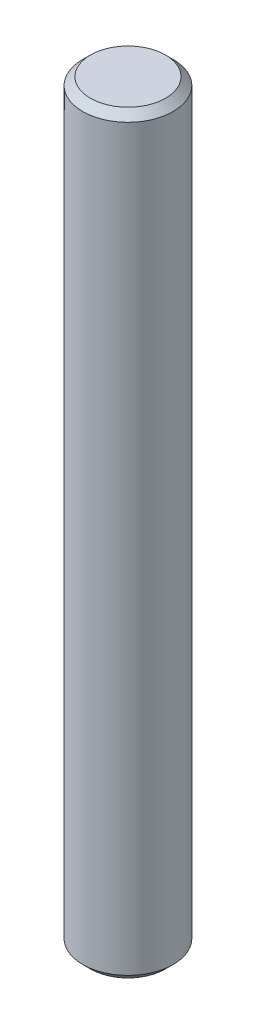
ISO-10303-21;
HEADER;
FILE_DESCRIPTION(('STEP AP214'),'2;1');
FILE_NAME('part.step','',(''),(''),'','','');
FILE_SCHEMA(('AUTOMOTIVE_DESIGN { 1 0 10303 214 1 1 1 1 }'));
ENDSEC;
DATA;
#1=APPLICATION_CONTEXT('core data for automotive mechanical design processes');
#2=APPLICATION_PROTOCOL_DEFINITION('international standard','automotive_design',2000,#1);
#3=PRODUCT_CONTEXT('',#1,'mechanical');
#4=PRODUCT('Part','Part','',(#3));
#5=PRODUCT_RELATED_PRODUCT_CATEGORY('part','',(#4));
#6=PRODUCT_DEFINITION_FORMATION('','',#4);
#7=PRODUCT_DEFINITION_CONTEXT('part definition',#1,'design');
#8=PRODUCT_DEFINITION('design','',#6,#7);
#9=PRODUCT_DEFINITION_SHAPE('','',#8);
#10=(LENGTH_UNIT() NAMED_UNIT(*) SI_UNIT(.MILLI.,.METRE.));
#11=(NAMED_UNIT(*) PLANE_ANGLE_UNIT() SI_UNIT($,.RADIAN.));
#12=(NAMED_UNIT(*) SI_UNIT($,.STERADIAN.) SOLID_ANGLE_UNIT());
#13=UNCERTAINTY_MEASURE_WITH_UNIT(LENGTH_MEASURE(1.E-05),#10,'distance_accuracy_value','');
#14=(GEOMETRIC_REPRESENTATION_CONTEXT(3) GLOBAL_UNCERTAINTY_ASSIGNED_CONTEXT((#13)) GLOBAL_UNIT_ASSIGNED_CONTEXT((#10,
#11,#12)) REPRESENTATION_CONTEXT('',''));
#15=CARTESIAN_POINT('',(0.,0.,0.));
#16=DIRECTION('',(0.,0.,1.));
#17=DIRECTION('',(1.,0.,0.));
#18=AXIS2_PLACEMENT_3D('',#15,#16,#17);
#19=CARTESIAN_POINT('',(0.,0.508000000000002,0.));
#20=DIRECTION('',(0.,1.,0.));
#21=DIRECTION('',(-1.,0.,0.));
#22=AXIS2_PLACEMENT_3D('',#19,#20,#21);
#23=CONICAL_SURFACE('',#22,2.99618999989459,0.785398163397448);
#24=CARTESIAN_POINT('',(0.,0.,0.));
#25=DIRECTION('',(0.,1.,0.));
#26=DIRECTION('',(-1.,0.,0.));
#27=AXIS2_PLACEMENT_3D('',#24,#25,#26);
#28=CIRCLE('',#27,2.48818999989459);
#29=CARTESIAN_POINT('',(-2.48818999989464,0.,0.));
#30=VERTEX_POINT('',#29);
#31=EDGE_CURVE('E45',#30,#30,#28,.T.);
#32=ORIENTED_EDGE('',*,*,#31,.T.);
#33=EDGE_LOOP('',(#32));
#34=FACE_BOUND('',#33,.T.);
#35=CARTESIAN_POINT('',(0.,0.508000000000002,0.));
#36=DIRECTION('',(0.,1.,0.));
#37=DIRECTION('',(-1.,0.,0.));
#38=AXIS2_PLACEMENT_3D('',#35,#36,#37);
#39=CIRCLE('',#38,2.99618999989459);
#40=CARTESIAN_POINT('',(-2.99618999989465,0.508000000000002,0.));
#41=VERTEX_POINT('',#40);
#42=EDGE_CURVE('E10',#41,#41,#39,.T.);
#43=ORIENTED_EDGE('',*,*,#42,.F.);
#44=EDGE_LOOP('',(#43));
#45=FACE_BOUND('',#44,.T.);
#46=ADVANCED_FACE('F31',(#34,#45),#23,.T.);
#47=CARTESIAN_POINT('',(0.,0.,0.));
#48=DIRECTION('',(0.,1.,0.));
#49=DIRECTION('',(-1.,0.,0.));
#50=AXIS2_PLACEMENT_3D('',#47,#48,#49);
#51=CYLINDRICAL_SURFACE('',#50,2.99618999989459);
#52=ORIENTED_EDGE('',*,*,#42,.T.);
#53=EDGE_LOOP('',(#52));
#54=FACE_BOUND('',#53,.T.);
#55=CARTESIAN_POINT('',(0.,49.492,0.));
#56=DIRECTION('',(0.,1.,0.));
#57=DIRECTION('',(-1.,0.,0.));
#58=AXIS2_PLACEMENT_3D('',#55,#56,#57);
#59=CIRCLE('',#58,2.9961899998946);
#60=CARTESIAN_POINT('',(-2.99618999989465,49.492,0.));
#61=VERTEX_POINT('',#60);
#62=EDGE_CURVE('E37',#61,#61,#59,.T.);
#63=ORIENTED_EDGE('',*,*,#62,.F.);
#64=EDGE_LOOP('',(#63));
#65=FACE_BOUND('',#64,.T.);
#66=ADVANCED_FACE('F64',(#54,#65),#51,.T.);
#67=CARTESIAN_POINT('',(0.,50.0000000000057,0.));
#68=DIRECTION('',(0.,-1.,0.));
#69=DIRECTION('',(1.,0.,0.));
#70=AXIS2_PLACEMENT_3D('',#67,#68,#69);
#71=CONICAL_SURFACE('',#70,2.48818999988891,0.785398163397447);
#72=ORIENTED_EDGE('',*,*,#62,.T.);
#73=EDGE_LOOP('',(#72));
#74=FACE_BOUND('',#73,.T.);
#75=CARTESIAN_POINT('',(0.,50.0000000000057,0.));
#76=DIRECTION('',(0.,1.,0.));
#77=DIRECTION('',(-1.,0.,0.));
#78=AXIS2_PLACEMENT_3D('',#75,#76,#77);
#79=CIRCLE('',#78,2.48818999988891);
#80=CARTESIAN_POINT('',(-2.48818999988896,50.0000000000057,0.));
#81=VERTEX_POINT('',#80);
#82=EDGE_CURVE('E41',#81,#81,#79,.T.);
#83=ORIENTED_EDGE('',*,*,#82,.F.);
#84=EDGE_LOOP('',(#83));
#85=FACE_BOUND('',#84,.T.);
#86=ADVANCED_FACE('F60',(#74,#85),#71,.T.);
#87=CARTESIAN_POINT('',(0.,50.0000000000057,0.));
#88=DIRECTION('',(0.,1.,0.));
#89=DIRECTION('',(-1.,0.,0.));
#90=AXIS2_PLACEMENT_3D('',#87,#88,#89);
#91=PLANE('',#90);
#92=ORIENTED_EDGE('',*,*,#82,.T.);
#93=EDGE_LOOP('',(#92));
#94=FACE_BOUND('',#93,.T.);
#95=ADVANCED_FACE('F55',(#94),#91,.T.);
#96=CARTESIAN_POINT('',(2.48818999989453,0.,0.));
#97=DIRECTION('',(0.,-1.,0.));
#98=DIRECTION('',(1.,0.,0.));
#99=AXIS2_PLACEMENT_3D('',#96,#97,#98);
#100=PLANE('',#99);
#101=ORIENTED_EDGE('',*,*,#31,.F.);
#102=EDGE_LOOP('',(#101));
#103=FACE_BOUND('',#102,.T.);
#104=ADVANCED_FACE('F53',(#103),#100,.T.);
#105=CLOSED_SHELL('',(#46,#66,#86,#95,#104));
#106=MANIFOLD_SOLID_BREP('B2',#105);
#107=ADVANCED_BREP_SHAPE_REPRESENTATION('',(#18,#106),#14);
#108=SHAPE_DEFINITION_REPRESENTATION(#9,#107);
ENDSEC;
END-ISO-10303-21;
